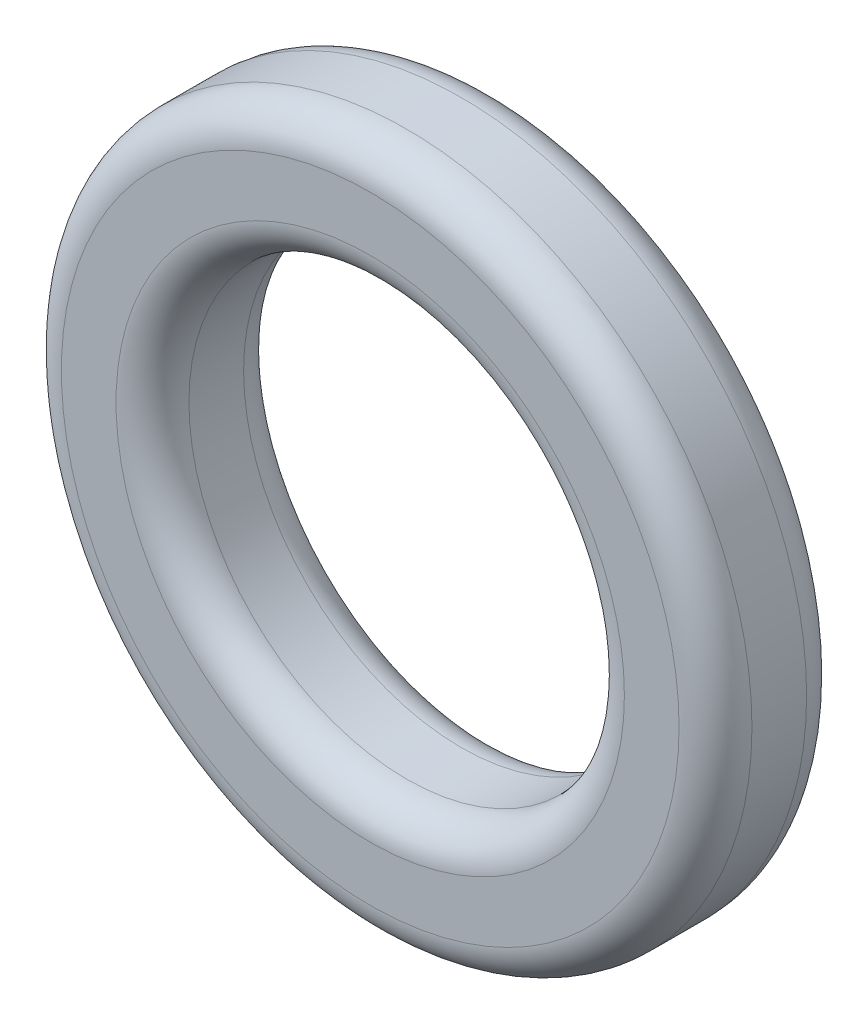
ISO-10303-21;
HEADER;
FILE_DESCRIPTION(('STEP AP214'),'2;1');
FILE_NAME('part.step','',(''),(''),'','','');
FILE_SCHEMA(('AUTOMOTIVE_DESIGN { 1 0 10303 214 1 1 1 1 }'));
ENDSEC;
DATA;
#1=APPLICATION_CONTEXT('core data for automotive mechanical design processes');
#2=APPLICATION_PROTOCOL_DEFINITION('international standard','automotive_design',2000,#1);
#3=PRODUCT_CONTEXT('',#1,'mechanical');
#4=PRODUCT('Part','Part','',(#3));
#5=PRODUCT_RELATED_PRODUCT_CATEGORY('part','',(#4));
#6=PRODUCT_DEFINITION_FORMATION('','',#4);
#7=PRODUCT_DEFINITION_CONTEXT('part definition',#1,'design');
#8=PRODUCT_DEFINITION('design','',#6,#7);
#9=PRODUCT_DEFINITION_SHAPE('','',#8);
#10=(LENGTH_UNIT() NAMED_UNIT(*) SI_UNIT(.MILLI.,.METRE.));
#11=(NAMED_UNIT(*) PLANE_ANGLE_UNIT() SI_UNIT($,.RADIAN.));
#12=(NAMED_UNIT(*) SI_UNIT($,.STERADIAN.) SOLID_ANGLE_UNIT());
#13=UNCERTAINTY_MEASURE_WITH_UNIT(LENGTH_MEASURE(1.E-05),#10,'distance_accuracy_value','');
#14=(GEOMETRIC_REPRESENTATION_CONTEXT(3) GLOBAL_UNCERTAINTY_ASSIGNED_CONTEXT((#13)) GLOBAL_UNIT_ASSIGNED_CONTEXT((#10,
#11,#12)) REPRESENTATION_CONTEXT('',''));
#15=CARTESIAN_POINT('',(0.,0.,0.));
#16=DIRECTION('',(0.,0.,1.));
#17=DIRECTION('',(1.,0.,0.));
#18=AXIS2_PLACEMENT_3D('',#15,#16,#17);
#19=CARTESIAN_POINT('',(0.,0.,1.778));
#20=DIRECTION('',(0.,0.,1.));
#21=DIRECTION('',(1.,0.,0.));
#22=AXIS2_PLACEMENT_3D('',#19,#20,#21);
#23=PLANE('',#22);
#24=CARTESIAN_POINT('',(0.,0.,1.778));
#25=DIRECTION('',(0.,0.,1.));
#26=DIRECTION('',(1.,0.,0.));
#27=AXIS2_PLACEMENT_3D('',#24,#25,#26);
#28=CIRCLE('',#27,3.5433);
#29=CARTESIAN_POINT('',(3.5433,0.,1.778));
#30=VERTEX_POINT('',#29);
#31=EDGE_CURVE('E10',#30,#30,#28,.F.);
#32=ORIENTED_EDGE('',*,*,#31,.T.);
#33=EDGE_LOOP('',(#32));
#34=FACE_BOUND('',#33,.T.);
#35=CARTESIAN_POINT('',(0.,0.,1.778));
#36=DIRECTION('',(0.,0.,1.));
#37=DIRECTION('',(1.,0.,0.));
#38=AXIS2_PLACEMENT_3D('',#35,#36,#37);
#39=CIRCLE('',#38,4.3053);
#40=CARTESIAN_POINT('',(4.3053,0.,1.778));
#41=VERTEX_POINT('',#40);
#42=EDGE_CURVE('E38',#41,#41,#39,.T.);
#43=ORIENTED_EDGE('',*,*,#42,.T.);
#44=EDGE_LOOP('',(#43));
#45=FACE_BOUND('',#44,.T.);
#46=ADVANCED_FACE('F31',(#34,#45),#23,.T.);
#47=CARTESIAN_POINT('',(0.,0.,0.));
#48=DIRECTION('',(0.,0.,1.));
#49=DIRECTION('',(1.,0.,0.));
#50=AXIS2_PLACEMENT_3D('',#47,#48,#49);
#51=PLANE('',#50);
#52=CARTESIAN_POINT('',(0.,0.,0.));
#53=DIRECTION('',(0.,0.,1.));
#54=DIRECTION('',(1.,0.,0.));
#55=AXIS2_PLACEMENT_3D('',#52,#53,#54);
#56=CIRCLE('',#55,3.5433);
#57=CARTESIAN_POINT('',(3.5433,0.,0.));
#58=VERTEX_POINT('',#57);
#59=EDGE_CURVE('E57',#58,#58,#56,.T.);
#60=ORIENTED_EDGE('',*,*,#59,.T.);
#61=EDGE_LOOP('',(#60));
#62=FACE_BOUND('',#61,.T.);
#63=CARTESIAN_POINT('',(0.,0.,0.));
#64=DIRECTION('',(0.,0.,1.));
#65=DIRECTION('',(1.,0.,0.));
#66=AXIS2_PLACEMENT_3D('',#63,#64,#65);
#67=CIRCLE('',#66,4.3053);
#68=CARTESIAN_POINT('',(4.3053,0.,0.));
#69=VERTEX_POINT('',#68);
#70=EDGE_CURVE('E60',#69,#69,#67,.F.);
#71=ORIENTED_EDGE('',*,*,#70,.T.);
#72=EDGE_LOOP('',(#71));
#73=FACE_BOUND('',#72,.T.);
#74=ADVANCED_FACE('F64',(#62,#73),#51,.F.);
#75=CARTESIAN_POINT('',(0.,0.,1.778));
#76=DIRECTION('',(0.,0.,-1.));
#77=DIRECTION('',(-1.,0.,0.));
#78=AXIS2_PLACEMENT_3D('',#75,#76,#77);
#79=CYLINDRICAL_SURFACE('',#78,4.8133);
#80=CARTESIAN_POINT('',(0.,0.,0.508));
#81=DIRECTION('',(0.,0.,1.));
#82=DIRECTION('',(1.,0.,0.));
#83=AXIS2_PLACEMENT_3D('',#80,#81,#82);
#84=CIRCLE('',#83,4.8133);
#85=CARTESIAN_POINT('',(4.8133,0.,0.508));
#86=VERTEX_POINT('',#85);
#87=EDGE_CURVE('E42',#86,#86,#84,.T.);
#88=ORIENTED_EDGE('',*,*,#87,.T.);
#89=EDGE_LOOP('',(#88));
#90=FACE_BOUND('',#89,.T.);
#91=CARTESIAN_POINT('',(0.,0.,1.27));
#92=DIRECTION('',(0.,0.,1.));
#93=DIRECTION('',(1.,0.,0.));
#94=AXIS2_PLACEMENT_3D('',#91,#92,#93);
#95=CIRCLE('',#94,4.8133);
#96=CARTESIAN_POINT('',(4.8133,0.,1.27));
#97=VERTEX_POINT('',#96);
#98=EDGE_CURVE('E46',#97,#97,#95,.F.);
#99=ORIENTED_EDGE('',*,*,#98,.T.);
#100=EDGE_LOOP('',(#99));
#101=FACE_BOUND('',#100,.T.);
#102=ADVANCED_FACE('F74',(#90,#101),#79,.T.);
#103=CARTESIAN_POINT('',(0.,0.,1.778));
#104=DIRECTION('',(0.,0.,-1.));
#105=DIRECTION('',(-1.,0.,0.));
#106=AXIS2_PLACEMENT_3D('',#103,#104,#105);
#107=CYLINDRICAL_SURFACE('',#106,3.0353);
#108=CARTESIAN_POINT('',(0.,0.,0.508));
#109=DIRECTION('',(0.,0.,1.));
#110=DIRECTION('',(1.,0.,0.));
#111=AXIS2_PLACEMENT_3D('',#108,#109,#110);
#112=CIRCLE('',#111,3.0353);
#113=CARTESIAN_POINT('',(3.0353,0.,0.508));
#114=VERTEX_POINT('',#113);
#115=EDGE_CURVE('E51',#114,#114,#112,.F.);
#116=ORIENTED_EDGE('',*,*,#115,.T.);
#117=EDGE_LOOP('',(#116));
#118=FACE_BOUND('',#117,.T.);
#119=CARTESIAN_POINT('',(0.,0.,1.27));
#120=DIRECTION('',(0.,0.,1.));
#121=DIRECTION('',(1.,0.,0.));
#122=AXIS2_PLACEMENT_3D('',#119,#120,#121);
#123=CIRCLE('',#122,3.0353);
#124=CARTESIAN_POINT('',(3.0353,0.,1.27));
#125=VERTEX_POINT('',#124);
#126=EDGE_CURVE('E54',#125,#125,#123,.T.);
#127=ORIENTED_EDGE('',*,*,#126,.T.);
#128=EDGE_LOOP('',(#127));
#129=FACE_BOUND('',#128,.T.);
#130=ADVANCED_FACE('F77',(#118,#129),#107,.F.);
#131=CARTESIAN_POINT('',(0.,0.,0.508));
#132=DIRECTION('',(0.,0.,1.));
#133=DIRECTION('',(1.,0.,0.));
#134=AXIS2_PLACEMENT_3D('',#131,#132,#133);
#135=TOROIDAL_SURFACE('',#134,3.5433,0.508);
#136=ORIENTED_EDGE('',*,*,#115,.F.);
#137=EDGE_LOOP('',(#136));
#138=FACE_BOUND('',#137,.T.);
#139=ORIENTED_EDGE('',*,*,#59,.F.);
#140=EDGE_LOOP('',(#139));
#141=FACE_BOUND('',#140,.T.);
#142=ADVANCED_FACE('F70',(#138,#141),#135,.T.);
#143=CARTESIAN_POINT('',(0.,0.,0.508));
#144=DIRECTION('',(0.,0.,1.));
#145=DIRECTION('',(1.,0.,0.));
#146=AXIS2_PLACEMENT_3D('',#143,#144,#145);
#147=TOROIDAL_SURFACE('',#146,4.3053,0.508);
#148=ORIENTED_EDGE('',*,*,#70,.F.);
#149=EDGE_LOOP('',(#148));
#150=FACE_BOUND('',#149,.T.);
#151=ORIENTED_EDGE('',*,*,#87,.F.);
#152=EDGE_LOOP('',(#151));
#153=FACE_BOUND('',#152,.T.);
#154=ADVANCED_FACE('F66',(#150,#153),#147,.T.);
#155=CARTESIAN_POINT('',(0.,0.,1.27));
#156=DIRECTION('',(0.,0.,1.));
#157=DIRECTION('',(1.,0.,0.));
#158=AXIS2_PLACEMENT_3D('',#155,#156,#157);
#159=TOROIDAL_SURFACE('',#158,3.5433,0.508);
#160=ORIENTED_EDGE('',*,*,#31,.F.);
#161=EDGE_LOOP('',(#160));
#162=FACE_BOUND('',#161,.T.);
#163=ORIENTED_EDGE('',*,*,#126,.F.);
#164=EDGE_LOOP('',(#163));
#165=FACE_BOUND('',#164,.T.);
#166=ADVANCED_FACE('F69',(#162,#165),#159,.T.);
#167=CARTESIAN_POINT('',(0.,0.,1.27));
#168=DIRECTION('',(0.,0.,1.));
#169=DIRECTION('',(1.,0.,0.));
#170=AXIS2_PLACEMENT_3D('',#167,#168,#169);
#171=TOROIDAL_SURFACE('',#170,4.3053,0.508);
#172=ORIENTED_EDGE('',*,*,#98,.F.);
#173=EDGE_LOOP('',(#172));
#174=FACE_BOUND('',#173,.T.);
#175=ORIENTED_EDGE('',*,*,#42,.F.);
#176=EDGE_LOOP('',(#175));
#177=FACE_BOUND('',#176,.T.);
#178=ADVANCED_FACE('F33',(#174,#177),#171,.T.);
#179=CLOSED_SHELL('',(#46,#74,#102,#130,#142,#154,#166,#178));
#180=MANIFOLD_SOLID_BREP('B2',#179);
#181=ADVANCED_BREP_SHAPE_REPRESENTATION('',(#18,#180),#14);
#182=SHAPE_DEFINITION_REPRESENTATION(#9,#181);
ENDSEC;
END-ISO-10303-21;
